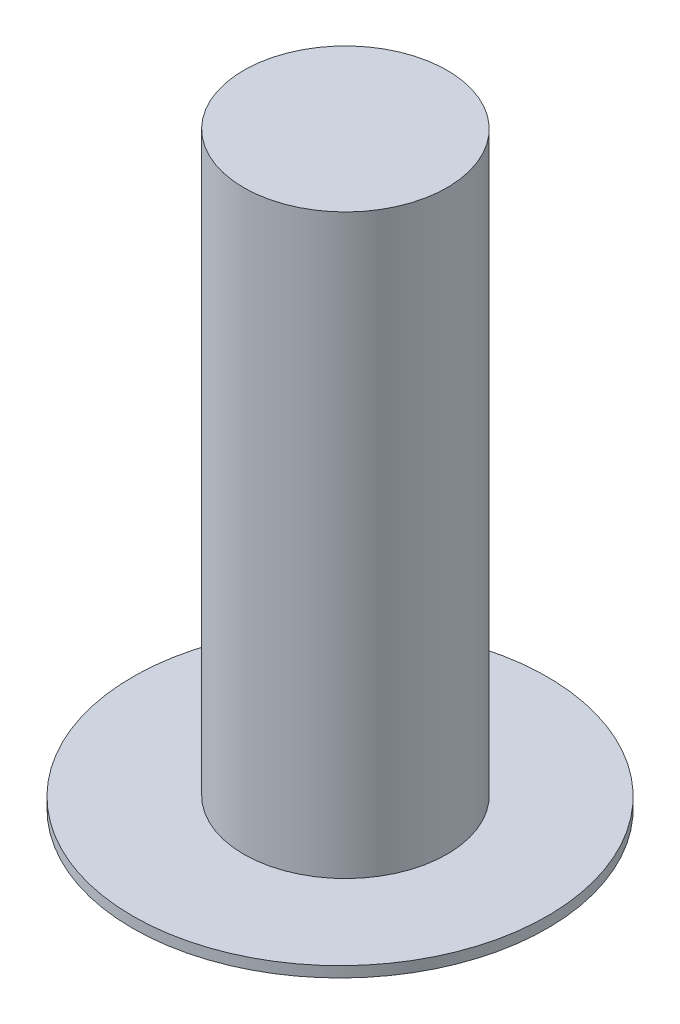
ISO-10303-21;
HEADER;
FILE_DESCRIPTION(('STEP AP214'),'2;1');
FILE_NAME('part.step','',(''),(''),'','','');
FILE_SCHEMA(('AUTOMOTIVE_DESIGN { 1 0 10303 214 1 1 1 1 }'));
ENDSEC;
DATA;
#1=APPLICATION_CONTEXT('core data for automotive mechanical design processes');
#2=APPLICATION_PROTOCOL_DEFINITION('international standard','automotive_design',2000,#1);
#3=PRODUCT_CONTEXT('',#1,'mechanical');
#4=PRODUCT('Part','Part','',(#3));
#5=PRODUCT_RELATED_PRODUCT_CATEGORY('part','',(#4));
#6=PRODUCT_DEFINITION_FORMATION('','',#4);
#7=PRODUCT_DEFINITION_CONTEXT('part definition',#1,'design');
#8=PRODUCT_DEFINITION('design','',#6,#7);
#9=PRODUCT_DEFINITION_SHAPE('','',#8);
#10=(LENGTH_UNIT() NAMED_UNIT(*) SI_UNIT(.MILLI.,.METRE.));
#11=(NAMED_UNIT(*) PLANE_ANGLE_UNIT() SI_UNIT($,.RADIAN.));
#12=(NAMED_UNIT(*) SI_UNIT($,.STERADIAN.) SOLID_ANGLE_UNIT());
#13=UNCERTAINTY_MEASURE_WITH_UNIT(LENGTH_MEASURE(1.E-05),#10,'distance_accuracy_value','');
#14=(GEOMETRIC_REPRESENTATION_CONTEXT(3) GLOBAL_UNCERTAINTY_ASSIGNED_CONTEXT((#13)) GLOBAL_UNIT_ASSIGNED_CONTEXT((#10,
#11,#12)) REPRESENTATION_CONTEXT('',''));
#15=CARTESIAN_POINT('',(0.,0.,0.));
#16=DIRECTION('',(0.,0.,1.));
#17=DIRECTION('',(1.,0.,0.));
#18=AXIS2_PLACEMENT_3D('',#15,#16,#17);
#19=CARTESIAN_POINT('',(-128.852862378878,0.671461598152731,-15.6006386774514));
#20=DIRECTION('',(0.,1.,0.));
#21=DIRECTION('',(0.,0.,1.));
#22=AXIS2_PLACEMENT_3D('',#19,#20,#21);
#23=PLANE('',#22);
#24=CARTESIAN_POINT('',(-128.733807544885,0.671461598152731,-15.8189058731057));
#25=DIRECTION('',(0.,1.,0.));
#26=DIRECTION('',(0.,0.,1.));
#27=AXIS2_PLACEMENT_3D('',#24,#25,#26);
#28=CIRCLE('',#27,6.39863586821151);
#29=CARTESIAN_POINT('',(-128.733807544885,0.671461598152731,-9.42027000489421));
#30=VERTEX_POINT('',#29);
#31=EDGE_CURVE('E51',#30,#30,#28,.T.);
#32=ORIENTED_EDGE('',*,*,#31,.F.);
#33=EDGE_LOOP('',(#32));
#34=FACE_BOUND('',#33,.T.);
#35=CARTESIAN_POINT('',(-128.852862378878,0.671461598152731,-15.6006386774514));
#36=DIRECTION('',(0.,1.,0.));
#37=DIRECTION('',(0.,0.,1.));
#38=AXIS2_PLACEMENT_3D('',#35,#36,#37);
#39=CIRCLE('',#38,13.040317797412);
#40=CARTESIAN_POINT('',(-128.852862378878,0.671461598152731,-2.56032088003938));
#41=VERTEX_POINT('',#40);
#42=EDGE_CURVE('E10',#41,#41,#39,.T.);
#43=ORIENTED_EDGE('',*,*,#42,.T.);
#44=EDGE_LOOP('',(#43));
#45=FACE_BOUND('',#44,.T.);
#46=ADVANCED_FACE('F32',(#34,#45),#23,.T.);
#47=CARTESIAN_POINT('',(-128.852862378878,0.,-15.6006386774514));
#48=DIRECTION('',(0.,1.,0.));
#49=DIRECTION('',(0.,0.,1.));
#50=AXIS2_PLACEMENT_3D('',#47,#48,#49);
#51=PLANE('',#50);
#52=CARTESIAN_POINT('',(-128.852862378878,0.,-15.6006386774514));
#53=DIRECTION('',(0.,1.,0.));
#54=DIRECTION('',(0.,0.,1.));
#55=AXIS2_PLACEMENT_3D('',#52,#53,#54);
#56=CIRCLE('',#55,13.040317797412);
#57=CARTESIAN_POINT('',(-128.852862378878,0.,-2.56032088003938));
#58=VERTEX_POINT('',#57);
#59=EDGE_CURVE('E36',#58,#58,#56,.T.);
#60=ORIENTED_EDGE('',*,*,#59,.F.);
#61=EDGE_LOOP('',(#60));
#62=FACE_BOUND('',#61,.T.);
#63=CARTESIAN_POINT('',(-128.852862378878,0.,-15.6006386774514));
#64=DIRECTION('',(0.,1.,0.));
#65=DIRECTION('',(0.,0.,1.));
#66=AXIS2_PLACEMENT_3D('',#63,#64,#65);
#67=CIRCLE('',#66,5.51829830606759);
#68=CARTESIAN_POINT('',(-128.852862378878,0.,-10.0823403713838));
#69=VERTEX_POINT('',#68);
#70=EDGE_CURVE('E43',#69,#69,#67,.T.);
#71=ORIENTED_EDGE('',*,*,#70,.T.);
#72=EDGE_LOOP('',(#71));
#73=FACE_BOUND('',#72,.T.);
#74=ADVANCED_FACE('F67',(#62,#73),#51,.F.);
#75=CARTESIAN_POINT('',(-128.852862378878,0.671461598152731,-15.6006386774514));
#76=DIRECTION('',(0.,-1.,0.));
#77=DIRECTION('',(0.,0.,-1.));
#78=AXIS2_PLACEMENT_3D('',#75,#76,#77);
#79=CYLINDRICAL_SURFACE('',#78,13.040317797412);
#80=ORIENTED_EDGE('',*,*,#42,.F.);
#81=EDGE_LOOP('',(#80));
#82=FACE_BOUND('',#81,.T.);
#83=ORIENTED_EDGE('',*,*,#59,.T.);
#84=EDGE_LOOP('',(#83));
#85=FACE_BOUND('',#84,.T.);
#86=ADVANCED_FACE('F34',(#82,#85),#79,.T.);
#87=CARTESIAN_POINT('',(-128.852862378878,0.671461598152731,-15.6006386774514));
#88=DIRECTION('',(0.,-1.,0.));
#89=DIRECTION('',(0.,0.,-1.));
#90=AXIS2_PLACEMENT_3D('',#87,#88,#89);
#91=CYLINDRICAL_SURFACE('',#90,5.51829830606759);
#92=CARTESIAN_POINT('',(-128.852862378878,0.671461598152731,-15.6006386774514));
#93=DIRECTION('',(0.,1.,0.));
#94=DIRECTION('',(0.,0.,1.));
#95=AXIS2_PLACEMENT_3D('',#92,#93,#94);
#96=CIRCLE('',#95,5.51829830606759);
#97=CARTESIAN_POINT('',(-128.852862378878,0.671461598152731,-10.0823403713838));
#98=VERTEX_POINT('',#97);
#99=EDGE_CURVE('E47',#98,#98,#96,.T.);
#100=ORIENTED_EDGE('',*,*,#99,.T.);
#101=EDGE_LOOP('',(#100));
#102=FACE_BOUND('',#101,.T.);
#103=ORIENTED_EDGE('',*,*,#70,.F.);
#104=EDGE_LOOP('',(#103));
#105=FACE_BOUND('',#104,.T.);
#106=ADVANCED_FACE('F74',(#102,#105),#91,.F.);
#107=CARTESIAN_POINT('',(-128.733807544885,0.671461598152731,-15.8189058731057));
#108=DIRECTION('',(0.,1.,0.));
#109=DIRECTION('',(0.,0.,1.));
#110=AXIS2_PLACEMENT_3D('',#107,#108,#109);
#111=PLANE('',#110);
#112=ORIENTED_EDGE('',*,*,#99,.F.);
#113=EDGE_LOOP('',(#112));
#114=FACE_BOUND('',#113,.T.);
#115=ADVANCED_FACE('F62',(#114),#111,.F.);
#116=CARTESIAN_POINT('',(-128.733807544885,36.9934615981527,-15.8189058731057));
#117=DIRECTION('',(0.,-1.,0.));
#118=DIRECTION('',(0.,0.,-1.));
#119=AXIS2_PLACEMENT_3D('',#116,#117,#118);
#120=CYLINDRICAL_SURFACE('',#119,6.39863586821151);
#121=CARTESIAN_POINT('',(-128.733807544885,36.9934615981527,-15.8189058731057));
#122=DIRECTION('',(0.,1.,0.));
#123=DIRECTION('',(0.,0.,1.));
#124=AXIS2_PLACEMENT_3D('',#121,#122,#123);
#125=CIRCLE('',#124,6.39863586821151);
#126=CARTESIAN_POINT('',(-128.733807544885,36.9934615981527,-9.42027000489421));
#127=VERTEX_POINT('',#126);
#128=EDGE_CURVE('E50',#127,#127,#125,.T.);
#129=ORIENTED_EDGE('',*,*,#128,.F.);
#130=EDGE_LOOP('',(#129));
#131=FACE_BOUND('',#130,.T.);
#132=ORIENTED_EDGE('',*,*,#31,.T.);
#133=EDGE_LOOP('',(#132));
#134=FACE_BOUND('',#133,.T.);
#135=ADVANCED_FACE('F59',(#131,#134),#120,.T.);
#136=CARTESIAN_POINT('',(-128.733807544885,36.9934615981527,-15.8189058731057));
#137=DIRECTION('',(0.,1.,0.));
#138=DIRECTION('',(0.,0.,1.));
#139=AXIS2_PLACEMENT_3D('',#136,#137,#138);
#140=PLANE('',#139);
#141=ORIENTED_EDGE('',*,*,#128,.T.);
#142=EDGE_LOOP('',(#141));
#143=FACE_BOUND('',#142,.T.);
#144=ADVANCED_FACE('F57',(#143),#140,.T.);
#145=CLOSED_SHELL('',(#46,#74,#86,#106,#115,#135,#144));
#146=MANIFOLD_SOLID_BREP('B2',#145);
#147=ADVANCED_BREP_SHAPE_REPRESENTATION('',(#18,#146),#14);
#148=SHAPE_DEFINITION_REPRESENTATION(#9,#147);
ENDSEC;
END-ISO-10303-21;
